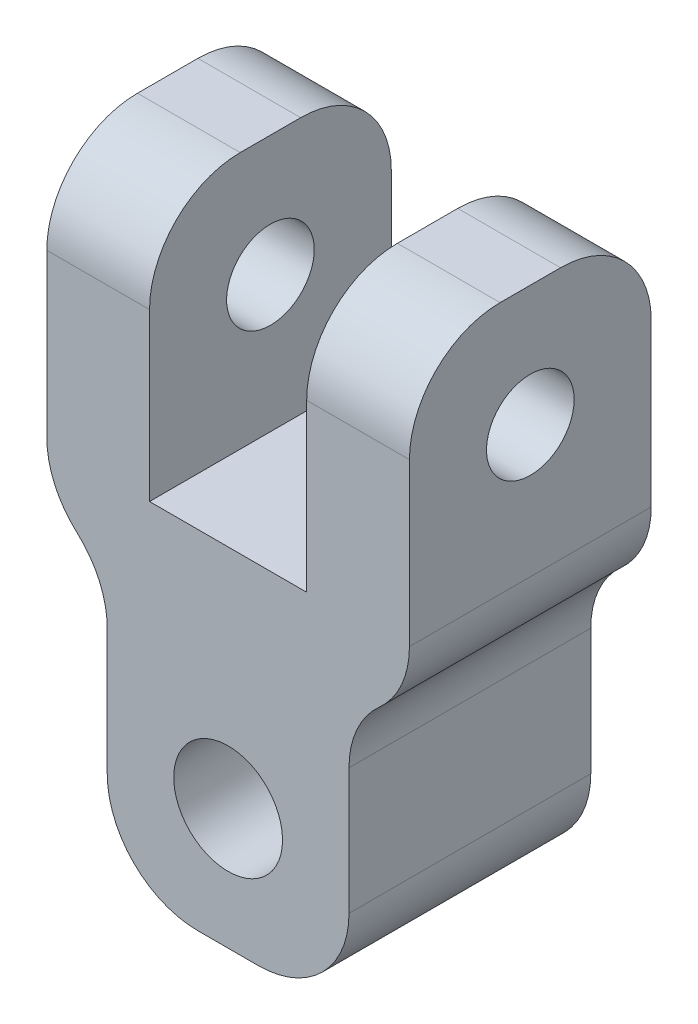
ISO-10303-21;
HEADER;
FILE_DESCRIPTION(('STEP AP214'),'2;1');
FILE_NAME('part.step','',(''),(''),'','','');
FILE_SCHEMA(('AUTOMOTIVE_DESIGN { 1 0 10303 214 1 1 1 1 }'));
ENDSEC;
DATA;
#1=APPLICATION_CONTEXT('core data for automotive mechanical design processes');
#2=APPLICATION_PROTOCOL_DEFINITION('international standard','automotive_design',2000,#1);
#3=PRODUCT_CONTEXT('',#1,'mechanical');
#4=PRODUCT('Part','Part','',(#3));
#5=PRODUCT_RELATED_PRODUCT_CATEGORY('part','',(#4));
#6=PRODUCT_DEFINITION_FORMATION('','',#4);
#7=PRODUCT_DEFINITION_CONTEXT('part definition',#1,'design');
#8=PRODUCT_DEFINITION('design','',#6,#7);
#9=PRODUCT_DEFINITION_SHAPE('','',#8);
#10=(LENGTH_UNIT() NAMED_UNIT(*) SI_UNIT(.MILLI.,.METRE.));
#11=(NAMED_UNIT(*) PLANE_ANGLE_UNIT() SI_UNIT($,.RADIAN.));
#12=(NAMED_UNIT(*) SI_UNIT($,.STERADIAN.) SOLID_ANGLE_UNIT());
#13=UNCERTAINTY_MEASURE_WITH_UNIT(LENGTH_MEASURE(1.E-05),#10,'distance_accuracy_value','');
#14=(GEOMETRIC_REPRESENTATION_CONTEXT(3) GLOBAL_UNCERTAINTY_ASSIGNED_CONTEXT((#13)) GLOBAL_UNIT_ASSIGNED_CONTEXT((#10,
#11,#12)) REPRESENTATION_CONTEXT('',''));
#15=CARTESIAN_POINT('',(0.,0.,0.));
#16=DIRECTION('',(0.,0.,1.));
#17=DIRECTION('',(1.,0.,0.));
#18=AXIS2_PLACEMENT_3D('',#15,#16,#17);
#19=CARTESIAN_POINT('',(0.,20.,0.));
#20=DIRECTION('',(0.,1.,0.));
#21=DIRECTION('',(0.,0.,1.));
#22=AXIS2_PLACEMENT_3D('',#19,#20,#21);
#23=PLANE('',#22);
#24=DIRECTION('',(0.,0.,1.));
#25=VECTOR('',#24,1.);
#26=CARTESIAN_POINT('',(1.4,20.,0.));
#27=LINE('',#26,#25);
#28=CARTESIAN_POINT('',(1.4,20.,3.));
#29=VERTEX_POINT('',#28);
#30=CARTESIAN_POINT('',(1.4,20.,5.));
#31=VERTEX_POINT('',#30);
#32=EDGE_CURVE('E207',#29,#31,#27,.T.);
#33=ORIENTED_EDGE('',*,*,#32,.F.);
#34=DIRECTION('',(-1.,0.,0.));
#35=VECTOR('',#34,1.);
#36=CARTESIAN_POINT('',(-2.,20.,3.));
#37=LINE('',#36,#35);
#38=CARTESIAN_POINT('',(-2.,20.,3.));
#39=VERTEX_POINT('',#38);
#40=EDGE_CURVE('E327',#29,#39,#37,.T.);
#41=ORIENTED_EDGE('',*,*,#40,.T.);
#42=DIRECTION('',(0.,0.,1.));
#43=VECTOR('',#42,1.);
#44=CARTESIAN_POINT('',(-2.,20.,0.));
#45=LINE('',#44,#43);
#46=CARTESIAN_POINT('',(-2.,20.,5.));
#47=VERTEX_POINT('',#46);
#48=EDGE_CURVE('E220',#39,#47,#45,.T.);
#49=ORIENTED_EDGE('',*,*,#48,.T.);
#50=DIRECTION('',(1.,0.,0.));
#51=VECTOR('',#50,1.);
#52=CARTESIAN_POINT('',(1.4,20.,5.));
#53=LINE('',#52,#51);
#54=EDGE_CURVE('E324',#47,#31,#53,.T.);
#55=ORIENTED_EDGE('',*,*,#54,.T.);
#56=EDGE_LOOP('',(#33,#41,#49,#55));
#57=FACE_BOUND('',#56,.T.);
#58=ADVANCED_FACE('F33',(#57),#23,.T.);
#59=CARTESIAN_POINT('',(0.,20.,0.));
#60=DIRECTION('',(1.,0.,0.));
#61=DIRECTION('',(0.,0.,-1.));
#62=AXIS2_PLACEMENT_3D('',#59,#60,#61);
#63=PLANE('',#62);
#64=DIRECTION('',(0.,-1.,0.));
#65=VECTOR('',#64,1.);
#66=CARTESIAN_POINT('',(0.,20.,0.));
#67=LINE('',#66,#65);
#68=CARTESIAN_POINT('',(0.,7.17157287525381,0.));
#69=VERTEX_POINT('',#68);
#70=CARTESIAN_POINT('',(0.,3.,0.));
#71=VERTEX_POINT('',#70);
#72=EDGE_CURVE('E241',#69,#71,#67,.T.);
#73=ORIENTED_EDGE('',*,*,#72,.T.);
#74=DIRECTION('',(0.,0.,1.));
#75=VECTOR('',#74,1.);
#76=CARTESIAN_POINT('',(0.,3.,0.));
#77=LINE('',#76,#75);
#78=CARTESIAN_POINT('',(0.,3.,8.));
#79=VERTEX_POINT('',#78);
#80=EDGE_CURVE('E269',#71,#79,#77,.T.);
#81=ORIENTED_EDGE('',*,*,#80,.T.);
#82=DIRECTION('',(0.,-1.,0.));
#83=VECTOR('',#82,1.);
#84=CARTESIAN_POINT('',(0.,20.,8.));
#85=LINE('',#84,#83);
#86=CARTESIAN_POINT('',(0.,7.17157287525381,8.));
#87=VERTEX_POINT('',#86);
#88=EDGE_CURVE('E250',#87,#79,#85,.T.);
#89=ORIENTED_EDGE('',*,*,#88,.F.);
#90=DIRECTION('',(0.,0.,-1.));
#91=VECTOR('',#90,1.);
#92=CARTESIAN_POINT('',(0.,7.17157287525381,0.));
#93=LINE('',#92,#91);
#94=EDGE_CURVE('E256',#87,#69,#93,.T.);
#95=ORIENTED_EDGE('',*,*,#94,.T.);
#96=EDGE_LOOP('',(#73,#81,#89,#95));
#97=FACE_BOUND('',#96,.T.);
#98=ADVANCED_FACE('F383',(#97),#63,.F.);
#99=CARTESIAN_POINT('',(0.,20.,8.));
#100=DIRECTION('',(0.,0.,-1.));
#101=DIRECTION('',(-1.,0.,0.));
#102=AXIS2_PLACEMENT_3D('',#99,#100,#101);
#103=PLANE('',#102);
#104=CARTESIAN_POINT('',(4.,4.,8.));
#105=DIRECTION('',(0.,0.,1.));
#106=DIRECTION('',(1.,0.,0.));
#107=AXIS2_PLACEMENT_3D('',#104,#105,#106);
#108=CIRCLE('',#107,1.8);
#109=CARTESIAN_POINT('',(5.8,4.,8.));
#110=VERTEX_POINT('',#109);
#111=EDGE_CURVE('E229',#110,#110,#108,.T.);
#112=ORIENTED_EDGE('',*,*,#111,.F.);
#113=EDGE_LOOP('',(#112));
#114=FACE_BOUND('',#113,.T.);
#115=ORIENTED_EDGE('',*,*,#88,.T.);
#116=CARTESIAN_POINT('',(3.,3.,8.));
#117=DIRECTION('',(0.,0.,-1.));
#118=DIRECTION('',(-1.,0.,0.));
#119=AXIS2_PLACEMENT_3D('',#116,#117,#118);
#120=CIRCLE('',#119,3.);
#121=CARTESIAN_POINT('',(3.,0.,8.));
#122=VERTEX_POINT('',#121);
#123=EDGE_CURVE('E286',#79,#122,#120,.F.);
#124=ORIENTED_EDGE('',*,*,#123,.T.);
#125=DIRECTION('',(1.,0.,0.));
#126=VECTOR('',#125,1.);
#127=CARTESIAN_POINT('',(0.,0.,8.));
#128=LINE('',#127,#126);
#129=CARTESIAN_POINT('',(5.,0.,8.));
#130=VERTEX_POINT('',#129);
#131=EDGE_CURVE('E234',#122,#130,#128,.T.);
#132=ORIENTED_EDGE('',*,*,#131,.T.);
#133=CARTESIAN_POINT('',(5.,3.,8.));
#134=DIRECTION('',(0.,0.,-1.));
#135=DIRECTION('',(-1.,0.,0.));
#136=AXIS2_PLACEMENT_3D('',#133,#134,#135);
#137=CIRCLE('',#136,3.);
#138=CARTESIAN_POINT('',(8.,3.,8.));
#139=VERTEX_POINT('',#138);
#140=EDGE_CURVE('E284',#130,#139,#137,.F.);
#141=ORIENTED_EDGE('',*,*,#140,.T.);
#142=DIRECTION('',(0.,-1.,0.));
#143=VECTOR('',#142,1.);
#144=CARTESIAN_POINT('',(8.,20.,8.));
#145=LINE('',#144,#143);
#146=CARTESIAN_POINT('',(8.,7.17157287525381,8.));
#147=VERTEX_POINT('',#146);
#148=EDGE_CURVE('E247',#147,#139,#145,.T.);
#149=ORIENTED_EDGE('',*,*,#148,.F.);
#150=CARTESIAN_POINT('',(11.,7.17157287525381,8.));
#151=DIRECTION('',(0.,0.,-1.));
#152=DIRECTION('',(-1.,0.,0.));
#153=AXIS2_PLACEMENT_3D('',#150,#151,#152);
#154=CIRCLE('',#153,3.);
#155=CARTESIAN_POINT('',(9.,9.4076408527536,8.));
#156=VERTEX_POINT('',#155);
#157=EDGE_CURVE('E259',#147,#156,#154,.T.);
#158=ORIENTED_EDGE('',*,*,#157,.T.);
#159=CARTESIAN_POINT('',(7.,11.6437088302534,8.));
#160=DIRECTION('',(0.,0.,-1.));
#161=DIRECTION('',(-1.,0.,0.));
#162=AXIS2_PLACEMENT_3D('',#159,#160,#161);
#163=CIRCLE('',#162,3.);
#164=CARTESIAN_POINT('',(10.,11.6437088302534,8.));
#165=VERTEX_POINT('',#164);
#166=EDGE_CURVE('E280',#156,#165,#163,.F.);
#167=ORIENTED_EDGE('',*,*,#166,.T.);
#168=DIRECTION('',(0.,1.,0.));
#169=VECTOR('',#168,1.);
#170=CARTESIAN_POINT('',(10.,10.,8.));
#171=LINE('',#170,#169);
#172=CARTESIAN_POINT('',(10.,17.,8.));
#173=VERTEX_POINT('',#172);
#174=EDGE_CURVE('E216',#165,#173,#171,.T.);
#175=ORIENTED_EDGE('',*,*,#174,.T.);
#176=DIRECTION('',(1.,0.,0.));
#177=VECTOR('',#176,1.);
#178=CARTESIAN_POINT('',(6.6,17.,8.));
#179=LINE('',#178,#177);
#180=CARTESIAN_POINT('',(6.6,17.,8.));
#181=VERTEX_POINT('',#180);
#182=EDGE_CURVE('E276',#173,#181,#179,.F.);
#183=ORIENTED_EDGE('',*,*,#182,.T.);
#184=DIRECTION('',(0.,1.,0.));
#185=VECTOR('',#184,1.);
#186=CARTESIAN_POINT('',(6.6,20.,8.));
#187=LINE('',#186,#185);
#188=CARTESIAN_POINT('',(6.6,11.5,8.));
#189=VERTEX_POINT('',#188);
#190=EDGE_CURVE('E183',#189,#181,#187,.T.);
#191=ORIENTED_EDGE('',*,*,#190,.F.);
#192=DIRECTION('',(1.,0.,0.));
#193=VECTOR('',#192,1.);
#194=CARTESIAN_POINT('',(1.4,11.5,8.));
#195=LINE('',#194,#193);
#196=CARTESIAN_POINT('',(1.4,11.5,8.));
#197=VERTEX_POINT('',#196);
#198=EDGE_CURVE('E203',#197,#189,#195,.T.);
#199=ORIENTED_EDGE('',*,*,#198,.F.);
#200=DIRECTION('',(0.,-1.,0.));
#201=VECTOR('',#200,1.);
#202=CARTESIAN_POINT('',(1.4,20.,8.));
#203=LINE('',#202,#201);
#204=CARTESIAN_POINT('',(1.4,17.,8.));
#205=VERTEX_POINT('',#204);
#206=EDGE_CURVE('E189',#205,#197,#203,.T.);
#207=ORIENTED_EDGE('',*,*,#206,.F.);
#208=DIRECTION('',(1.,0.,0.));
#209=VECTOR('',#208,1.);
#210=CARTESIAN_POINT('',(-2.,17.,8.));
#211=LINE('',#210,#209);
#212=CARTESIAN_POINT('',(-2.,17.,8.));
#213=VERTEX_POINT('',#212);
#214=EDGE_CURVE('E278',#205,#213,#211,.F.);
#215=ORIENTED_EDGE('',*,*,#214,.T.);
#216=DIRECTION('',(0.,1.,0.));
#217=VECTOR('',#216,1.);
#218=CARTESIAN_POINT('',(-2.,10.,8.));
#219=LINE('',#218,#217);
#220=CARTESIAN_POINT('',(-2.,11.6437088302534,8.));
#221=VERTEX_POINT('',#220);
#222=EDGE_CURVE('E226',#221,#213,#219,.T.);
#223=ORIENTED_EDGE('',*,*,#222,.F.);
#224=CARTESIAN_POINT('',(1.,11.6437088302534,8.));
#225=DIRECTION('',(0.,0.,-1.));
#226=DIRECTION('',(-1.,0.,0.));
#227=AXIS2_PLACEMENT_3D('',#224,#225,#226);
#228=CIRCLE('',#227,3.);
#229=CARTESIAN_POINT('',(-0.999999999999999,9.4076408527536,8.));
#230=VERTEX_POINT('',#229);
#231=EDGE_CURVE('E282',#221,#230,#228,.F.);
#232=ORIENTED_EDGE('',*,*,#231,.T.);
#233=CARTESIAN_POINT('',(-3.,7.17157287525381,8.));
#234=DIRECTION('',(0.,0.,-1.));
#235=DIRECTION('',(-1.,0.,0.));
#236=AXIS2_PLACEMENT_3D('',#233,#234,#235);
#237=CIRCLE('',#236,3.);
#238=EDGE_CURVE('E267',#230,#87,#237,.T.);
#239=ORIENTED_EDGE('',*,*,#238,.T.);
#240=EDGE_LOOP('',(#115,#124,#132,#141,#149,#158,#167,#175,#183,#191,#199,#207,#215,#223,#232,#239));
#241=FACE_BOUND('',#240,.T.);
#242=ADVANCED_FACE('F353',(#114,#241),#103,.F.);
#243=CARTESIAN_POINT('',(8.,20.,0.));
#244=DIRECTION('',(-1.,0.,0.));
#245=DIRECTION('',(0.,0.,1.));
#246=AXIS2_PLACEMENT_3D('',#243,#244,#245);
#247=PLANE('',#246);
#248=ORIENTED_EDGE('',*,*,#148,.T.);
#249=DIRECTION('',(0.,0.,-1.));
#250=VECTOR('',#249,1.);
#251=CARTESIAN_POINT('',(8.,3.,0.));
#252=LINE('',#251,#250);
#253=CARTESIAN_POINT('',(8.,3.,0.));
#254=VERTEX_POINT('',#253);
#255=EDGE_CURVE('E303',#139,#254,#252,.T.);
#256=ORIENTED_EDGE('',*,*,#255,.T.);
#257=DIRECTION('',(0.,-1.,0.));
#258=VECTOR('',#257,1.);
#259=CARTESIAN_POINT('',(8.,20.,0.));
#260=LINE('',#259,#258);
#261=CARTESIAN_POINT('',(8.,7.17157287525381,0.));
#262=VERTEX_POINT('',#261);
#263=EDGE_CURVE('E244',#262,#254,#260,.T.);
#264=ORIENTED_EDGE('',*,*,#263,.F.);
#265=DIRECTION('',(0.,0.,-1.));
#266=VECTOR('',#265,1.);
#267=CARTESIAN_POINT('',(8.,7.17157287525381,0.));
#268=LINE('',#267,#266);
#269=EDGE_CURVE('E253',#262,#147,#268,.F.);
#270=ORIENTED_EDGE('',*,*,#269,.T.);
#271=EDGE_LOOP('',(#248,#256,#264,#270));
#272=FACE_BOUND('',#271,.T.);
#273=ADVANCED_FACE('F366',(#272),#247,.F.);
#274=CARTESIAN_POINT('',(0.,20.,0.));
#275=DIRECTION('',(0.,0.,1.));
#276=DIRECTION('',(1.,0.,0.));
#277=AXIS2_PLACEMENT_3D('',#274,#275,#276);
#278=PLANE('',#277);
#279=DIRECTION('',(-1.,0.,0.));
#280=VECTOR('',#279,1.);
#281=CARTESIAN_POINT('',(0.,0.,0.));
#282=LINE('',#281,#280);
#283=CARTESIAN_POINT('',(5.,0.,0.));
#284=VERTEX_POINT('',#283);
#285=CARTESIAN_POINT('',(3.,0.,0.));
#286=VERTEX_POINT('',#285);
#287=EDGE_CURVE('E239',#284,#286,#282,.T.);
#288=ORIENTED_EDGE('',*,*,#287,.T.);
#289=CARTESIAN_POINT('',(3.,3.,0.));
#290=DIRECTION('',(0.,0.,1.));
#291=DIRECTION('',(1.,0.,0.));
#292=AXIS2_PLACEMENT_3D('',#289,#290,#291);
#293=CIRCLE('',#292,3.);
#294=EDGE_CURVE('E301',#286,#71,#293,.F.);
#295=ORIENTED_EDGE('',*,*,#294,.T.);
#296=ORIENTED_EDGE('',*,*,#72,.F.);
#297=CARTESIAN_POINT('',(-3.,7.17157287525381,0.));
#298=DIRECTION('',(0.,0.,1.));
#299=DIRECTION('',(1.,0.,0.));
#300=AXIS2_PLACEMENT_3D('',#297,#298,#299);
#301=CIRCLE('',#300,3.);
#302=CARTESIAN_POINT('',(-0.999999999999997,9.4076408527536,0.));
#303=VERTEX_POINT('',#302);
#304=EDGE_CURVE('E264',#69,#303,#301,.T.);
#305=ORIENTED_EDGE('',*,*,#304,.T.);
#306=CARTESIAN_POINT('',(1.,11.6437088302534,0.));
#307=DIRECTION('',(0.,0.,1.));
#308=DIRECTION('',(1.,0.,0.));
#309=AXIS2_PLACEMENT_3D('',#306,#307,#308);
#310=CIRCLE('',#309,3.);
#311=CARTESIAN_POINT('',(-2.,11.6437088302534,0.));
#312=VERTEX_POINT('',#311);
#313=EDGE_CURVE('E297',#303,#312,#310,.F.);
#314=ORIENTED_EDGE('',*,*,#313,.T.);
#315=DIRECTION('',(0.,1.,0.));
#316=VECTOR('',#315,1.);
#317=CARTESIAN_POINT('',(-2.,10.,0.));
#318=LINE('',#317,#316);
#319=CARTESIAN_POINT('',(-2.,17.,0.));
#320=VERTEX_POINT('',#319);
#321=EDGE_CURVE('E225',#312,#320,#318,.T.);
#322=ORIENTED_EDGE('',*,*,#321,.T.);
#323=DIRECTION('',(-1.,0.,0.));
#324=VECTOR('',#323,1.);
#325=CARTESIAN_POINT('',(1.4,17.,0.));
#326=LINE('',#325,#324);
#327=CARTESIAN_POINT('',(1.4,17.,0.));
#328=VERTEX_POINT('',#327);
#329=EDGE_CURVE('E180',#320,#328,#326,.F.);
#330=ORIENTED_EDGE('',*,*,#329,.T.);
#331=DIRECTION('',(0.,-1.,0.));
#332=VECTOR('',#331,1.);
#333=CARTESIAN_POINT('',(1.4,20.,0.));
#334=LINE('',#333,#332);
#335=CARTESIAN_POINT('',(1.4,11.5,0.));
#336=VERTEX_POINT('',#335);
#337=EDGE_CURVE('E170',#328,#336,#334,.T.);
#338=ORIENTED_EDGE('',*,*,#337,.T.);
#339=DIRECTION('',(1.,0.,0.));
#340=VECTOR('',#339,1.);
#341=CARTESIAN_POINT('',(1.4,11.5,0.));
#342=LINE('',#341,#340);
#343=CARTESIAN_POINT('',(6.6,11.5,0.));
#344=VERTEX_POINT('',#343);
#345=EDGE_CURVE('E177',#336,#344,#342,.T.);
#346=ORIENTED_EDGE('',*,*,#345,.T.);
#347=DIRECTION('',(0.,1.,0.));
#348=VECTOR('',#347,1.);
#349=CARTESIAN_POINT('',(6.6,20.,0.));
#350=LINE('',#349,#348);
#351=CARTESIAN_POINT('',(6.6,17.,0.));
#352=VERTEX_POINT('',#351);
#353=EDGE_CURVE('E194',#344,#352,#350,.T.);
#354=ORIENTED_EDGE('',*,*,#353,.T.);
#355=DIRECTION('',(-1.,0.,0.));
#356=VECTOR('',#355,1.);
#357=CARTESIAN_POINT('',(10.,17.,0.));
#358=LINE('',#357,#356);
#359=CARTESIAN_POINT('',(10.,17.,0.));
#360=VERTEX_POINT('',#359);
#361=EDGE_CURVE('E292',#352,#360,#358,.F.);
#362=ORIENTED_EDGE('',*,*,#361,.T.);
#363=DIRECTION('',(0.,1.,0.));
#364=VECTOR('',#363,1.);
#365=CARTESIAN_POINT('',(10.,10.,0.));
#366=LINE('',#365,#364);
#367=CARTESIAN_POINT('',(10.,11.6437088302534,0.));
#368=VERTEX_POINT('',#367);
#369=EDGE_CURVE('E217',#368,#360,#366,.T.);
#370=ORIENTED_EDGE('',*,*,#369,.F.);
#371=CARTESIAN_POINT('',(7.,11.6437088302534,0.));
#372=DIRECTION('',(0.,0.,1.));
#373=DIRECTION('',(1.,0.,0.));
#374=AXIS2_PLACEMENT_3D('',#371,#372,#373);
#375=CIRCLE('',#374,3.);
#376=CARTESIAN_POINT('',(9.,9.4076408527536,0.));
#377=VERTEX_POINT('',#376);
#378=EDGE_CURVE('E295',#368,#377,#375,.F.);
#379=ORIENTED_EDGE('',*,*,#378,.T.);
#380=CARTESIAN_POINT('',(11.,7.17157287525381,0.));
#381=DIRECTION('',(0.,0.,1.));
#382=DIRECTION('',(1.,0.,0.));
#383=AXIS2_PLACEMENT_3D('',#380,#381,#382);
#384=CIRCLE('',#383,3.);
#385=EDGE_CURVE('E262',#377,#262,#384,.T.);
#386=ORIENTED_EDGE('',*,*,#385,.T.);
#387=ORIENTED_EDGE('',*,*,#263,.T.);
#388=CARTESIAN_POINT('',(5.,3.,0.));
#389=DIRECTION('',(0.,0.,1.));
#390=DIRECTION('',(1.,0.,0.));
#391=AXIS2_PLACEMENT_3D('',#388,#389,#390);
#392=CIRCLE('',#391,3.);
#393=EDGE_CURVE('E299',#254,#284,#392,.F.);
#394=ORIENTED_EDGE('',*,*,#393,.T.);
#395=EDGE_LOOP('',(#288,#295,#296,#305,#314,#322,#330,#338,#346,#354,#362,#370,#379,#386,#387,#394));
#396=FACE_BOUND('',#395,.T.);
#397=CARTESIAN_POINT('',(4.,4.,0.));
#398=DIRECTION('',(0.,0.,1.));
#399=DIRECTION('',(1.,0.,0.));
#400=AXIS2_PLACEMENT_3D('',#397,#398,#399);
#401=CIRCLE('',#400,1.8);
#402=CARTESIAN_POINT('',(5.8,4.,0.));
#403=VERTEX_POINT('',#402);
#404=EDGE_CURVE('E231',#403,#403,#401,.T.);
#405=ORIENTED_EDGE('',*,*,#404,.T.);
#406=EDGE_LOOP('',(#405));
#407=FACE_BOUND('',#406,.T.);
#408=ADVANCED_FACE('F173',(#396,#407),#278,.F.);
#409=DIRECTION('',(0.,0.,1.));
#410=VECTOR('',#409,1.);
#411=CARTESIAN_POINT('',(6.6,20.,0.));
#412=LINE('',#411,#410);
#413=CARTESIAN_POINT('',(6.6,20.,3.));
#414=VERTEX_POINT('',#413);
#415=CARTESIAN_POINT('',(6.6,20.,5.));
#416=VERTEX_POINT('',#415);
#417=EDGE_CURVE('E211',#414,#416,#412,.T.);
#418=ORIENTED_EDGE('',*,*,#417,.T.);
#419=DIRECTION('',(1.,0.,0.));
#420=VECTOR('',#419,1.);
#421=CARTESIAN_POINT('',(10.,20.,5.));
#422=LINE('',#421,#420);
#423=CARTESIAN_POINT('',(10.,20.,5.));
#424=VERTEX_POINT('',#423);
#425=EDGE_CURVE('E336',#416,#424,#422,.T.);
#426=ORIENTED_EDGE('',*,*,#425,.T.);
#427=DIRECTION('',(0.,0.,-1.));
#428=VECTOR('',#427,1.);
#429=CARTESIAN_POINT('',(10.,20.,0.));
#430=LINE('',#429,#428);
#431=CARTESIAN_POINT('',(10.,20.,3.));
#432=VERTEX_POINT('',#431);
#433=EDGE_CURVE('E210',#424,#432,#430,.T.);
#434=ORIENTED_EDGE('',*,*,#433,.T.);
#435=DIRECTION('',(-1.,0.,0.));
#436=VECTOR('',#435,1.);
#437=CARTESIAN_POINT('',(6.6,20.,3.));
#438=LINE('',#437,#436);
#439=EDGE_CURVE('E334',#432,#414,#438,.T.);
#440=ORIENTED_EDGE('',*,*,#439,.T.);
#441=EDGE_LOOP('',(#418,#426,#434,#440));
#442=FACE_BOUND('',#441,.T.);
#443=ADVANCED_FACE('F346',(#442),#23,.T.);
#444=CARTESIAN_POINT('',(0.,0.,0.));
#445=DIRECTION('',(0.,1.,0.));
#446=DIRECTION('',(0.,0.,1.));
#447=AXIS2_PLACEMENT_3D('',#444,#445,#446);
#448=PLANE('',#447);
#449=ORIENTED_EDGE('',*,*,#131,.F.);
#450=DIRECTION('',(0.,0.,1.));
#451=VECTOR('',#450,1.);
#452=CARTESIAN_POINT('',(3.,0.,0.));
#453=LINE('',#452,#451);
#454=EDGE_CURVE('E290',#122,#286,#453,.F.);
#455=ORIENTED_EDGE('',*,*,#454,.T.);
#456=ORIENTED_EDGE('',*,*,#287,.F.);
#457=DIRECTION('',(0.,0.,-1.));
#458=VECTOR('',#457,1.);
#459=CARTESIAN_POINT('',(5.,0.,0.));
#460=LINE('',#459,#458);
#461=EDGE_CURVE('E288',#284,#130,#460,.F.);
#462=ORIENTED_EDGE('',*,*,#461,.T.);
#463=EDGE_LOOP('',(#449,#455,#456,#462));
#464=FACE_BOUND('',#463,.T.);
#465=ADVANCED_FACE('F376',(#464),#448,.F.);
#466=CARTESIAN_POINT('',(4.,4.,0.));
#467=DIRECTION('',(0.,0.,1.));
#468=DIRECTION('',(1.,0.,0.));
#469=AXIS2_PLACEMENT_3D('',#466,#467,#468);
#470=CYLINDRICAL_SURFACE('',#469,1.8);
#471=ORIENTED_EDGE('',*,*,#404,.F.);
#472=EDGE_LOOP('',(#471));
#473=FACE_BOUND('',#472,.T.);
#474=ORIENTED_EDGE('',*,*,#111,.T.);
#475=EDGE_LOOP('',(#474));
#476=FACE_BOUND('',#475,.T.);
#477=ADVANCED_FACE('F430',(#473,#476),#470,.F.);
#478=CARTESIAN_POINT('',(-2.,10.,0.));
#479=DIRECTION('',(-1.,0.,0.));
#480=DIRECTION('',(0.,0.,1.));
#481=AXIS2_PLACEMENT_3D('',#478,#479,#480);
#482=PLANE('',#481);
#483=CARTESIAN_POINT('',(-2.,16.,4.));
#484=DIRECTION('',(1.,0.,0.));
#485=DIRECTION('',(0.,0.,-1.));
#486=AXIS2_PLACEMENT_3D('',#483,#484,#485);
#487=CIRCLE('',#486,1.45);
#488=CARTESIAN_POINT('',(-2.,16.,2.55));
#489=VERTEX_POINT('',#488);
#490=EDGE_CURVE('E273',#489,#489,#487,.T.);
#491=ORIENTED_EDGE('',*,*,#490,.T.);
#492=EDGE_LOOP('',(#491));
#493=FACE_BOUND('',#492,.T.);
#494=ORIENTED_EDGE('',*,*,#321,.F.);
#495=DIRECTION('',(0.,0.,1.));
#496=VECTOR('',#495,1.);
#497=CARTESIAN_POINT('',(-2.,11.6437088302534,8.));
#498=LINE('',#497,#496);
#499=EDGE_CURVE('E310',#312,#221,#498,.T.);
#500=ORIENTED_EDGE('',*,*,#499,.T.);
#501=ORIENTED_EDGE('',*,*,#222,.T.);
#502=CARTESIAN_POINT('',(-2.,17.,5.));
#503=DIRECTION('',(-1.,0.,0.));
#504=DIRECTION('',(0.,0.,1.));
#505=AXIS2_PLACEMENT_3D('',#502,#503,#504);
#506=CIRCLE('',#505,3.);
#507=EDGE_CURVE('E306',#213,#47,#506,.T.);
#508=ORIENTED_EDGE('',*,*,#507,.T.);
#509=ORIENTED_EDGE('',*,*,#48,.F.);
#510=CARTESIAN_POINT('',(-2.,17.,3.));
#511=DIRECTION('',(-1.,0.,0.));
#512=DIRECTION('',(0.,0.,1.));
#513=AXIS2_PLACEMENT_3D('',#510,#511,#512);
#514=CIRCLE('',#513,3.);
#515=EDGE_CURVE('E308',#39,#320,#514,.T.);
#516=ORIENTED_EDGE('',*,*,#515,.T.);
#517=EDGE_LOOP('',(#494,#500,#501,#508,#509,#516));
#518=FACE_BOUND('',#517,.T.);
#519=ADVANCED_FACE('F397',(#493,#518),#482,.T.);
#520=CARTESIAN_POINT('',(10.,10.,0.));
#521=DIRECTION('',(1.,0.,0.));
#522=DIRECTION('',(0.,0.,-1.));
#523=AXIS2_PLACEMENT_3D('',#520,#521,#522);
#524=PLANE('',#523);
#525=CARTESIAN_POINT('',(10.,16.,4.));
#526=DIRECTION('',(1.,0.,0.));
#527=DIRECTION('',(0.,0.,-1.));
#528=AXIS2_PLACEMENT_3D('',#525,#526,#527);
#529=CIRCLE('',#528,1.45);
#530=CARTESIAN_POINT('',(10.,16.,2.55));
#531=VERTEX_POINT('',#530);
#532=EDGE_CURVE('E637',#531,#531,#529,.T.);
#533=ORIENTED_EDGE('',*,*,#532,.F.);
#534=EDGE_LOOP('',(#533));
#535=FACE_BOUND('',#534,.T.);
#536=ORIENTED_EDGE('',*,*,#174,.F.);
#537=DIRECTION('',(0.,0.,1.));
#538=VECTOR('',#537,1.);
#539=CARTESIAN_POINT('',(10.,11.6437088302534,0.));
#540=LINE('',#539,#538);
#541=EDGE_CURVE('E319',#165,#368,#540,.F.);
#542=ORIENTED_EDGE('',*,*,#541,.T.);
#543=ORIENTED_EDGE('',*,*,#369,.T.);
#544=CARTESIAN_POINT('',(10.,17.,3.));
#545=DIRECTION('',(1.,0.,0.));
#546=DIRECTION('',(0.,0.,-1.));
#547=AXIS2_PLACEMENT_3D('',#544,#545,#546);
#548=CIRCLE('',#547,3.);
#549=EDGE_CURVE('E315',#360,#432,#548,.T.);
#550=ORIENTED_EDGE('',*,*,#549,.T.);
#551=ORIENTED_EDGE('',*,*,#433,.F.);
#552=CARTESIAN_POINT('',(10.,17.,5.));
#553=DIRECTION('',(1.,0.,0.));
#554=DIRECTION('',(0.,0.,-1.));
#555=AXIS2_PLACEMENT_3D('',#552,#553,#554);
#556=CIRCLE('',#555,3.);
#557=EDGE_CURVE('E317',#424,#173,#556,.T.);
#558=ORIENTED_EDGE('',*,*,#557,.T.);
#559=EDGE_LOOP('',(#536,#542,#543,#550,#551,#558));
#560=FACE_BOUND('',#559,.T.);
#561=ADVANCED_FACE('F344',(#535,#560),#524,.T.);
#562=CARTESIAN_POINT('',(1.4,20.,0.));
#563=DIRECTION('',(-1.,0.,0.));
#564=DIRECTION('',(0.,-1.,0.));
#565=AXIS2_PLACEMENT_3D('',#562,#563,#564);
#566=PLANE('',#565);
#567=CARTESIAN_POINT('',(1.4,16.,4.));
#568=DIRECTION('',(-1.,0.,0.));
#569=DIRECTION('',(0.,-1.,0.));
#570=AXIS2_PLACEMENT_3D('',#567,#568,#569);
#571=CIRCLE('',#570,1.45);
#572=CARTESIAN_POINT('',(1.4,14.55,4.));
#573=VERTEX_POINT('',#572);
#574=EDGE_CURVE('E204',#573,#573,#571,.T.);
#575=ORIENTED_EDGE('',*,*,#574,.T.);
#576=EDGE_LOOP('',(#575));
#577=FACE_BOUND('',#576,.T.);
#578=ORIENTED_EDGE('',*,*,#337,.F.);
#579=CARTESIAN_POINT('',(1.4,17.,3.));
#580=DIRECTION('',(-1.,0.,0.));
#581=DIRECTION('',(0.,-1.,0.));
#582=AXIS2_PLACEMENT_3D('',#579,#580,#581);
#583=CIRCLE('',#582,3.);
#584=EDGE_CURVE('E332',#328,#29,#583,.F.);
#585=ORIENTED_EDGE('',*,*,#584,.T.);
#586=ORIENTED_EDGE('',*,*,#32,.T.);
#587=CARTESIAN_POINT('',(1.4,17.,5.));
#588=DIRECTION('',(-1.,0.,0.));
#589=DIRECTION('',(0.,-1.,0.));
#590=AXIS2_PLACEMENT_3D('',#587,#588,#589);
#591=CIRCLE('',#590,3.);
#592=EDGE_CURVE('E330',#31,#205,#591,.F.);
#593=ORIENTED_EDGE('',*,*,#592,.T.);
#594=ORIENTED_EDGE('',*,*,#206,.T.);
#595=DIRECTION('',(0.,0.,1.));
#596=VECTOR('',#595,1.);
#597=CARTESIAN_POINT('',(1.4,11.5,0.));
#598=LINE('',#597,#596);
#599=EDGE_CURVE('E186',#336,#197,#598,.T.);
#600=ORIENTED_EDGE('',*,*,#599,.F.);
#601=EDGE_LOOP('',(#578,#585,#586,#593,#594,#600));
#602=FACE_BOUND('',#601,.T.);
#603=ADVANCED_FACE('F187',(#577,#602),#566,.F.);
#604=CARTESIAN_POINT('',(6.6,20.,0.));
#605=DIRECTION('',(1.,0.,0.));
#606=DIRECTION('',(0.,1.,0.));
#607=AXIS2_PLACEMENT_3D('',#604,#605,#606);
#608=PLANE('',#607);
#609=CARTESIAN_POINT('',(6.6,16.,4.));
#610=DIRECTION('',(1.,0.,0.));
#611=DIRECTION('',(0.,1.,0.));
#612=AXIS2_PLACEMENT_3D('',#609,#610,#611);
#613=CIRCLE('',#612,1.45);
#614=CARTESIAN_POINT('',(6.6,17.45,4.));
#615=VERTEX_POINT('',#614);
#616=EDGE_CURVE('E270',#615,#615,#613,.T.);
#617=ORIENTED_EDGE('',*,*,#616,.T.);
#618=EDGE_LOOP('',(#617));
#619=FACE_BOUND('',#618,.T.);
#620=ORIENTED_EDGE('',*,*,#190,.T.);
#621=CARTESIAN_POINT('',(6.6,17.,5.));
#622=DIRECTION('',(1.,0.,0.));
#623=DIRECTION('',(0.,1.,0.));
#624=AXIS2_PLACEMENT_3D('',#621,#622,#623);
#625=CIRCLE('',#624,3.);
#626=EDGE_CURVE('E11',#181,#416,#625,.F.);
#627=ORIENTED_EDGE('',*,*,#626,.T.);
#628=ORIENTED_EDGE('',*,*,#417,.F.);
#629=CARTESIAN_POINT('',(6.6,17.,3.));
#630=DIRECTION('',(1.,0.,0.));
#631=DIRECTION('',(0.,1.,0.));
#632=AXIS2_PLACEMENT_3D('',#629,#630,#631);
#633=CIRCLE('',#632,3.);
#634=EDGE_CURVE('E41',#414,#352,#633,.F.);
#635=ORIENTED_EDGE('',*,*,#634,.T.);
#636=ORIENTED_EDGE('',*,*,#353,.F.);
#637=DIRECTION('',(0.,0.,1.));
#638=VECTOR('',#637,1.);
#639=CARTESIAN_POINT('',(6.6,11.5,0.));
#640=LINE('',#639,#638);
#641=EDGE_CURVE('E193',#344,#189,#640,.T.);
#642=ORIENTED_EDGE('',*,*,#641,.T.);
#643=EDGE_LOOP('',(#620,#627,#628,#635,#636,#642));
#644=FACE_BOUND('',#643,.T.);
#645=ADVANCED_FACE('F338',(#619,#644),#608,.F.);
#646=CARTESIAN_POINT('',(1.4,11.5,0.));
#647=DIRECTION('',(0.,-1.,0.));
#648=DIRECTION('',(0.,0.,-1.));
#649=AXIS2_PLACEMENT_3D('',#646,#647,#648);
#650=PLANE('',#649);
#651=ORIENTED_EDGE('',*,*,#198,.T.);
#652=ORIENTED_EDGE('',*,*,#641,.F.);
#653=ORIENTED_EDGE('',*,*,#345,.F.);
#654=ORIENTED_EDGE('',*,*,#599,.T.);
#655=EDGE_LOOP('',(#651,#652,#653,#654));
#656=FACE_BOUND('',#655,.T.);
#657=ADVANCED_FACE('F196',(#656),#650,.F.);
#658=CARTESIAN_POINT('',(11.,7.17157287525381,0.));
#659=DIRECTION('',(0.,0.,-1.));
#660=DIRECTION('',(-1.,0.,0.));
#661=AXIS2_PLACEMENT_3D('',#658,#659,#660);
#662=CYLINDRICAL_SURFACE('',#661,3.);
#663=ORIENTED_EDGE('',*,*,#385,.F.);
#664=DIRECTION('',(0.,0.,-1.));
#665=VECTOR('',#664,1.);
#666=CARTESIAN_POINT('',(9.,9.4076408527536,0.));
#667=LINE('',#666,#665);
#668=EDGE_CURVE('E322',#377,#156,#667,.F.);
#669=ORIENTED_EDGE('',*,*,#668,.T.);
#670=ORIENTED_EDGE('',*,*,#157,.F.);
#671=ORIENTED_EDGE('',*,*,#269,.F.);
#672=EDGE_LOOP('',(#663,#669,#670,#671));
#673=FACE_BOUND('',#672,.T.);
#674=ADVANCED_FACE('F364',(#673),#662,.F.);
#675=CARTESIAN_POINT('',(-3.,7.17157287525381,0.));
#676=DIRECTION('',(0.,0.,-1.));
#677=DIRECTION('',(-1.,0.,0.));
#678=AXIS2_PLACEMENT_3D('',#675,#676,#677);
#679=CYLINDRICAL_SURFACE('',#678,3.);
#680=ORIENTED_EDGE('',*,*,#238,.F.);
#681=DIRECTION('',(0.,0.,-1.));
#682=VECTOR('',#681,1.);
#683=CARTESIAN_POINT('',(-0.999999999999998,9.4076408527536,0.));
#684=LINE('',#683,#682);
#685=EDGE_CURVE('E313',#230,#303,#684,.T.);
#686=ORIENTED_EDGE('',*,*,#685,.T.);
#687=ORIENTED_EDGE('',*,*,#304,.F.);
#688=ORIENTED_EDGE('',*,*,#94,.F.);
#689=EDGE_LOOP('',(#680,#686,#687,#688));
#690=FACE_BOUND('',#689,.T.);
#691=ADVANCED_FACE('F388',(#690),#679,.F.);
#692=CARTESIAN_POINT('',(-2.,16.,4.));
#693=DIRECTION('',(1.,0.,0.));
#694=DIRECTION('',(0.,0.,-1.));
#695=AXIS2_PLACEMENT_3D('',#692,#693,#694);
#696=CYLINDRICAL_SURFACE('',#695,1.45);
#697=ORIENTED_EDGE('',*,*,#532,.T.);
#698=EDGE_LOOP('',(#697));
#699=FACE_BOUND('',#698,.T.);
#700=ORIENTED_EDGE('',*,*,#616,.F.);
#701=EDGE_LOOP('',(#700));
#702=FACE_BOUND('',#701,.T.);
#703=ADVANCED_FACE('F444',(#699,#702),#696,.F.);
#704=ORIENTED_EDGE('',*,*,#490,.F.);
#705=EDGE_LOOP('',(#704));
#706=FACE_BOUND('',#705,.T.);
#707=ORIENTED_EDGE('',*,*,#574,.F.);
#708=EDGE_LOOP('',(#707));
#709=FACE_BOUND('',#708,.T.);
#710=ADVANCED_FACE('F447',(#706,#709),#696,.F.);
#711=CARTESIAN_POINT('',(3.,3.,0.));
#712=DIRECTION('',(0.,0.,1.));
#713=DIRECTION('',(1.,0.,0.));
#714=AXIS2_PLACEMENT_3D('',#711,#712,#713);
#715=CYLINDRICAL_SURFACE('',#714,3.);
#716=ORIENTED_EDGE('',*,*,#294,.F.);
#717=ORIENTED_EDGE('',*,*,#454,.F.);
#718=ORIENTED_EDGE('',*,*,#123,.F.);
#719=ORIENTED_EDGE('',*,*,#80,.F.);
#720=EDGE_LOOP('',(#716,#717,#718,#719));
#721=FACE_BOUND('',#720,.T.);
#722=ADVANCED_FACE('F379',(#721),#715,.T.);
#723=CARTESIAN_POINT('',(5.,3.,0.));
#724=DIRECTION('',(0.,0.,-1.));
#725=DIRECTION('',(-1.,0.,0.));
#726=AXIS2_PLACEMENT_3D('',#723,#724,#725);
#727=CYLINDRICAL_SURFACE('',#726,3.);
#728=ORIENTED_EDGE('',*,*,#140,.F.);
#729=ORIENTED_EDGE('',*,*,#461,.F.);
#730=ORIENTED_EDGE('',*,*,#393,.F.);
#731=ORIENTED_EDGE('',*,*,#255,.F.);
#732=EDGE_LOOP('',(#728,#729,#730,#731));
#733=FACE_BOUND('',#732,.T.);
#734=ADVANCED_FACE('F372',(#733),#727,.T.);
#735=CARTESIAN_POINT('',(1.,11.6437088302534,0.));
#736=DIRECTION('',(0.,0.,-1.));
#737=DIRECTION('',(-1.,0.,0.));
#738=AXIS2_PLACEMENT_3D('',#735,#736,#737);
#739=CYLINDRICAL_SURFACE('',#738,3.);
#740=ORIENTED_EDGE('',*,*,#313,.F.);
#741=ORIENTED_EDGE('',*,*,#685,.F.);
#742=ORIENTED_EDGE('',*,*,#231,.F.);
#743=ORIENTED_EDGE('',*,*,#499,.F.);
#744=EDGE_LOOP('',(#740,#741,#742,#743));
#745=FACE_BOUND('',#744,.T.);
#746=ADVANCED_FACE('F394',(#745),#739,.T.);
#747=CARTESIAN_POINT('',(7.,11.6437088302534,0.));
#748=DIRECTION('',(0.,0.,-1.));
#749=DIRECTION('',(-1.,0.,0.));
#750=AXIS2_PLACEMENT_3D('',#747,#748,#749);
#751=CYLINDRICAL_SURFACE('',#750,3.);
#752=ORIENTED_EDGE('',*,*,#166,.F.);
#753=ORIENTED_EDGE('',*,*,#668,.F.);
#754=ORIENTED_EDGE('',*,*,#378,.F.);
#755=ORIENTED_EDGE('',*,*,#541,.F.);
#756=EDGE_LOOP('',(#752,#753,#754,#755));
#757=FACE_BOUND('',#756,.T.);
#758=ADVANCED_FACE('F359',(#757),#751,.T.);
#759=CARTESIAN_POINT('',(0.,17.,3.));
#760=DIRECTION('',(1.,0.,0.));
#761=DIRECTION('',(0.,0.,-1.));
#762=AXIS2_PLACEMENT_3D('',#759,#760,#761);
#763=CYLINDRICAL_SURFACE('',#762,3.);
#764=ORIENTED_EDGE('',*,*,#584,.F.);
#765=ORIENTED_EDGE('',*,*,#329,.F.);
#766=ORIENTED_EDGE('',*,*,#515,.F.);
#767=ORIENTED_EDGE('',*,*,#40,.F.);
#768=EDGE_LOOP('',(#764,#765,#766,#767));
#769=FACE_BOUND('',#768,.T.);
#770=ADVANCED_FACE('F408',(#769),#763,.T.);
#771=CARTESIAN_POINT('',(0.,17.,5.));
#772=DIRECTION('',(-1.,0.,0.));
#773=DIRECTION('',(0.,0.,1.));
#774=AXIS2_PLACEMENT_3D('',#771,#772,#773);
#775=CYLINDRICAL_SURFACE('',#774,3.);
#776=ORIENTED_EDGE('',*,*,#507,.F.);
#777=ORIENTED_EDGE('',*,*,#214,.F.);
#778=ORIENTED_EDGE('',*,*,#592,.F.);
#779=ORIENTED_EDGE('',*,*,#54,.F.);
#780=EDGE_LOOP('',(#776,#777,#778,#779));
#781=FACE_BOUND('',#780,.T.);
#782=ADVANCED_FACE('F401',(#781),#775,.T.);
#783=CARTESIAN_POINT('',(0.,17.,5.));
#784=DIRECTION('',(-1.,0.,0.));
#785=DIRECTION('',(0.,0.,1.));
#786=AXIS2_PLACEMENT_3D('',#783,#784,#785);
#787=CYLINDRICAL_SURFACE('',#786,3.);
#788=ORIENTED_EDGE('',*,*,#626,.F.);
#789=ORIENTED_EDGE('',*,*,#182,.F.);
#790=ORIENTED_EDGE('',*,*,#557,.F.);
#791=ORIENTED_EDGE('',*,*,#425,.F.);
#792=EDGE_LOOP('',(#788,#789,#790,#791));
#793=FACE_BOUND('',#792,.T.);
#794=ADVANCED_FACE('F349',(#793),#787,.T.);
#795=CARTESIAN_POINT('',(0.,17.,3.));
#796=DIRECTION('',(1.,0.,0.));
#797=DIRECTION('',(0.,0.,-1.));
#798=AXIS2_PLACEMENT_3D('',#795,#796,#797);
#799=CYLINDRICAL_SURFACE('',#798,3.);
#800=ORIENTED_EDGE('',*,*,#549,.F.);
#801=ORIENTED_EDGE('',*,*,#361,.F.);
#802=ORIENTED_EDGE('',*,*,#634,.F.);
#803=ORIENTED_EDGE('',*,*,#439,.F.);
#804=EDGE_LOOP('',(#800,#801,#802,#803));
#805=FACE_BOUND('',#804,.T.);
#806=ADVANCED_FACE('F35',(#805),#799,.T.);
#807=CLOSED_SHELL('',(#58,#98,#242,#273,#408,#443,#465,#477,#519,#561,#603,#645,#657,#674,#691,
#703,#710,#722,#734,#746,#758,#770,#782,#794,#806));
#808=MANIFOLD_SOLID_BREP('B2',#807);
#809=ADVANCED_BREP_SHAPE_REPRESENTATION('',(#18,#808),#14);
#810=SHAPE_DEFINITION_REPRESENTATION(#9,#809);
ENDSEC;
END-ISO-10303-21;
